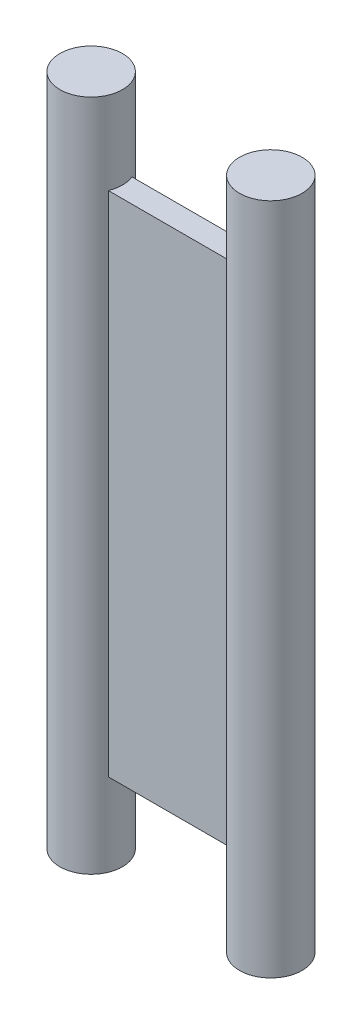
ISO-10303-21;
HEADER;
FILE_DESCRIPTION(('STEP AP214'),'2;1');
FILE_NAME('part.step','',(''),(''),'','','');
FILE_SCHEMA(('AUTOMOTIVE_DESIGN { 1 0 10303 214 1 1 1 1 }'));
ENDSEC;
DATA;
#1=APPLICATION_CONTEXT('core data for automotive mechanical design processes');
#2=APPLICATION_PROTOCOL_DEFINITION('international standard','automotive_design',2000,#1);
#3=PRODUCT_CONTEXT('',#1,'mechanical');
#4=PRODUCT('Part','Part','',(#3));
#5=PRODUCT_RELATED_PRODUCT_CATEGORY('part','',(#4));
#6=PRODUCT_DEFINITION_FORMATION('','',#4);
#7=PRODUCT_DEFINITION_CONTEXT('part definition',#1,'design');
#8=PRODUCT_DEFINITION('design','',#6,#7);
#9=PRODUCT_DEFINITION_SHAPE('','',#8);
#10=(LENGTH_UNIT() NAMED_UNIT(*) SI_UNIT(.MILLI.,.METRE.));
#11=(NAMED_UNIT(*) PLANE_ANGLE_UNIT() SI_UNIT($,.RADIAN.));
#12=(NAMED_UNIT(*) SI_UNIT($,.STERADIAN.) SOLID_ANGLE_UNIT());
#13=UNCERTAINTY_MEASURE_WITH_UNIT(LENGTH_MEASURE(1.E-05),#10,'distance_accuracy_value','');
#14=(GEOMETRIC_REPRESENTATION_CONTEXT(3) GLOBAL_UNCERTAINTY_ASSIGNED_CONTEXT((#13)) GLOBAL_UNIT_ASSIGNED_CONTEXT((#10,
#11,#12)) REPRESENTATION_CONTEXT('',''));
#15=CARTESIAN_POINT('',(0.,0.,0.));
#16=DIRECTION('',(0.,0.,1.));
#17=DIRECTION('',(1.,0.,0.));
#18=AXIS2_PLACEMENT_3D('',#15,#16,#17);
#19=CARTESIAN_POINT('',(3.803,21.5,0.5));
#20=DIRECTION('',(0.,0.,-1.));
#21=DIRECTION('',(-1.,0.,0.));
#22=AXIS2_PLACEMENT_3D('',#19,#20,#21);
#23=PLANE('',#22);
#24=DIRECTION('',(0.,-1.,0.));
#25=VECTOR('',#24,1.);
#26=CARTESIAN_POINT('',(2.5759608808192,25.,0.5));
#27=LINE('',#26,#25);
#28=CARTESIAN_POINT('',(2.5759608808192,21.5,0.5));
#29=VERTEX_POINT('',#28);
#30=CARTESIAN_POINT('',(2.5759608808192,0.,0.499999999999999));
#31=VERTEX_POINT('',#30);
#32=EDGE_CURVE('E53',#29,#31,#27,.T.);
#33=ORIENTED_EDGE('',*,*,#32,.F.);
#34=DIRECTION('',(1.,0.,0.));
#35=VECTOR('',#34,1.);
#36=CARTESIAN_POINT('',(3.803,21.5,0.5));
#37=LINE('',#36,#35);
#38=CARTESIAN_POINT('',(-2.5759608808192,21.5,0.5));
#39=VERTEX_POINT('',#38);
#40=EDGE_CURVE('E90',#39,#29,#37,.T.);
#41=ORIENTED_EDGE('',*,*,#40,.F.);
#42=DIRECTION('',(0.,-1.,0.));
#43=VECTOR('',#42,1.);
#44=CARTESIAN_POINT('',(-2.5759608808192,25.,0.5));
#45=LINE('',#44,#43);
#46=CARTESIAN_POINT('',(-2.5759608808192,0.,0.5));
#47=VERTEX_POINT('',#46);
#48=EDGE_CURVE('E103',#47,#39,#45,.F.);
#49=ORIENTED_EDGE('',*,*,#48,.F.);
#50=DIRECTION('',(1.,0.,0.));
#51=VECTOR('',#50,1.);
#52=CARTESIAN_POINT('',(3.803,0.,0.5));
#53=LINE('',#52,#51);
#54=EDGE_CURVE('E91',#47,#31,#53,.T.);
#55=ORIENTED_EDGE('',*,*,#54,.T.);
#56=EDGE_LOOP('',(#33,#41,#49,#55));
#57=FACE_BOUND('',#56,.T.);
#58=ADVANCED_FACE('F39',(#57),#23,.F.);
#59=CARTESIAN_POINT('',(3.803,21.5,-0.5));
#60=DIRECTION('',(0.,0.,1.));
#61=DIRECTION('',(1.,0.,0.));
#62=AXIS2_PLACEMENT_3D('',#59,#60,#61);
#63=PLANE('',#62);
#64=DIRECTION('',(0.,-1.,0.));
#65=VECTOR('',#64,1.);
#66=CARTESIAN_POINT('',(2.5759608808192,25.,-0.5));
#67=LINE('',#66,#65);
#68=CARTESIAN_POINT('',(2.5759608808192,0.,-0.5));
#69=VERTEX_POINT('',#68);
#70=CARTESIAN_POINT('',(2.5759608808192,21.5,-0.5));
#71=VERTEX_POINT('',#70);
#72=EDGE_CURVE('E78',#69,#71,#67,.F.);
#73=ORIENTED_EDGE('',*,*,#72,.F.);
#74=DIRECTION('',(-1.,0.,0.));
#75=VECTOR('',#74,1.);
#76=CARTESIAN_POINT('',(3.803,0.,-0.5));
#77=LINE('',#76,#75);
#78=CARTESIAN_POINT('',(-2.5759608808192,0.,-0.499999999999999));
#79=VERTEX_POINT('',#78);
#80=EDGE_CURVE('E60',#69,#79,#77,.T.);
#81=ORIENTED_EDGE('',*,*,#80,.T.);
#82=DIRECTION('',(0.,-1.,0.));
#83=VECTOR('',#82,1.);
#84=CARTESIAN_POINT('',(-2.5759608808192,25.,-0.5));
#85=LINE('',#84,#83);
#86=CARTESIAN_POINT('',(-2.5759608808192,21.5,-0.5));
#87=VERTEX_POINT('',#86);
#88=EDGE_CURVE('E105',#87,#79,#85,.T.);
#89=ORIENTED_EDGE('',*,*,#88,.F.);
#90=DIRECTION('',(-1.,0.,0.));
#91=VECTOR('',#90,1.);
#92=CARTESIAN_POINT('',(3.803,21.5,-0.5));
#93=LINE('',#92,#91);
#94=EDGE_CURVE('E85',#71,#87,#93,.T.);
#95=ORIENTED_EDGE('',*,*,#94,.F.);
#96=EDGE_LOOP('',(#73,#81,#89,#95));
#97=FACE_BOUND('',#96,.T.);
#98=ADVANCED_FACE('F84',(#97),#63,.F.);
#99=CARTESIAN_POINT('',(-3.803,25.,0.));
#100=DIRECTION('',(0.,-1.,0.));
#101=DIRECTION('',(0.,0.,-1.));
#102=AXIS2_PLACEMENT_3D('',#99,#100,#101);
#103=CYLINDRICAL_SURFACE('',#102,1.325);
#104=CARTESIAN_POINT('',(-3.803,25.,0.));
#105=DIRECTION('',(0.,1.,0.));
#106=DIRECTION('',(0.,0.,1.));
#107=AXIS2_PLACEMENT_3D('',#104,#105,#106);
#108=CIRCLE('',#107,1.325);
#109=CARTESIAN_POINT('',(-3.803,25.,1.325));
#110=VERTEX_POINT('',#109);
#111=EDGE_CURVE('E107',#110,#110,#108,.T.);
#112=ORIENTED_EDGE('',*,*,#111,.F.);
#113=EDGE_LOOP('',(#112));
#114=FACE_BOUND('',#113,.T.);
#115=CARTESIAN_POINT('',(-3.803,-3.5,0.));
#116=DIRECTION('',(0.,1.,0.));
#117=DIRECTION('',(0.,0.,1.));
#118=AXIS2_PLACEMENT_3D('',#115,#116,#117);
#119=CIRCLE('',#118,1.325);
#120=CARTESIAN_POINT('',(-3.803,-3.5,1.325));
#121=VERTEX_POINT('',#120);
#122=EDGE_CURVE('E108',#121,#121,#119,.T.);
#123=ORIENTED_EDGE('',*,*,#122,.T.);
#124=EDGE_LOOP('',(#123));
#125=FACE_BOUND('',#124,.T.);
#126=ORIENTED_EDGE('',*,*,#48,.T.);
#127=CARTESIAN_POINT('',(-3.803,21.5,0.));
#128=DIRECTION('',(0.,-1.,0.));
#129=DIRECTION('',(0.,0.,-1.));
#130=AXIS2_PLACEMENT_3D('',#127,#128,#129);
#131=CIRCLE('',#130,1.325);
#132=EDGE_CURVE('E95',#39,#87,#131,.F.);
#133=ORIENTED_EDGE('',*,*,#132,.T.);
#134=ORIENTED_EDGE('',*,*,#88,.T.);
#135=CARTESIAN_POINT('',(-3.803,0.,0.));
#136=DIRECTION('',(0.,-1.,0.));
#137=DIRECTION('',(0.,0.,-1.));
#138=AXIS2_PLACEMENT_3D('',#135,#136,#137);
#139=CIRCLE('',#138,1.325);
#140=EDGE_CURVE('E46',#47,#79,#139,.F.);
#141=ORIENTED_EDGE('',*,*,#140,.F.);
#142=EDGE_LOOP('',(#126,#133,#134,#141));
#143=FACE_BOUND('',#142,.T.);
#144=ADVANCED_FACE('F138',(#114,#125,#143),#103,.T.);
#145=CARTESIAN_POINT('',(-3.803,25.,0.));
#146=DIRECTION('',(0.,1.,0.));
#147=DIRECTION('',(0.,0.,1.));
#148=AXIS2_PLACEMENT_3D('',#145,#146,#147);
#149=PLANE('',#148);
#150=ORIENTED_EDGE('',*,*,#111,.T.);
#151=EDGE_LOOP('',(#150));
#152=FACE_BOUND('',#151,.T.);
#153=ADVANCED_FACE('F144',(#152),#149,.T.);
#154=CARTESIAN_POINT('',(-3.803,-3.5,0.));
#155=DIRECTION('',(0.,1.,0.));
#156=DIRECTION('',(0.,0.,1.));
#157=AXIS2_PLACEMENT_3D('',#154,#155,#156);
#158=PLANE('',#157);
#159=ORIENTED_EDGE('',*,*,#122,.F.);
#160=EDGE_LOOP('',(#159));
#161=FACE_BOUND('',#160,.T.);
#162=ADVANCED_FACE('F150',(#161),#158,.F.);
#163=CARTESIAN_POINT('',(0.,21.5,0.));
#164=DIRECTION('',(0.,-1.,0.));
#165=DIRECTION('',(0.,0.,-1.));
#166=AXIS2_PLACEMENT_3D('',#163,#164,#165);
#167=PLANE('',#166);
#168=CARTESIAN_POINT('',(3.803,21.5,0.));
#169=DIRECTION('',(0.,-1.,0.));
#170=DIRECTION('',(0.,0.,-1.));
#171=AXIS2_PLACEMENT_3D('',#168,#169,#170);
#172=CIRCLE('',#171,1.325);
#173=EDGE_CURVE('E111',#71,#29,#172,.F.);
#174=ORIENTED_EDGE('',*,*,#173,.F.);
#175=ORIENTED_EDGE('',*,*,#94,.T.);
#176=ORIENTED_EDGE('',*,*,#132,.F.);
#177=ORIENTED_EDGE('',*,*,#40,.T.);
#178=EDGE_LOOP('',(#174,#175,#176,#177));
#179=FACE_BOUND('',#178,.T.);
#180=ADVANCED_FACE('F141',(#179),#167,.F.);
#181=CARTESIAN_POINT('',(0.,0.,0.));
#182=DIRECTION('',(0.,-1.,0.));
#183=DIRECTION('',(0.,0.,-1.));
#184=AXIS2_PLACEMENT_3D('',#181,#182,#183);
#185=PLANE('',#184);
#186=ORIENTED_EDGE('',*,*,#80,.F.);
#187=CARTESIAN_POINT('',(3.803,0.,0.));
#188=DIRECTION('',(0.,-1.,0.));
#189=DIRECTION('',(0.,0.,-1.));
#190=AXIS2_PLACEMENT_3D('',#187,#188,#189);
#191=CIRCLE('',#190,1.325);
#192=EDGE_CURVE('E11',#69,#31,#191,.F.);
#193=ORIENTED_EDGE('',*,*,#192,.T.);
#194=ORIENTED_EDGE('',*,*,#54,.F.);
#195=ORIENTED_EDGE('',*,*,#140,.T.);
#196=EDGE_LOOP('',(#186,#193,#194,#195));
#197=FACE_BOUND('',#196,.T.);
#198=ADVANCED_FACE('F89',(#197),#185,.T.);
#199=CARTESIAN_POINT('',(3.803,25.,0.));
#200=DIRECTION('',(0.,-1.,0.));
#201=DIRECTION('',(0.,0.,-1.));
#202=AXIS2_PLACEMENT_3D('',#199,#200,#201);
#203=CYLINDRICAL_SURFACE('',#202,1.325);
#204=CARTESIAN_POINT('',(3.803,25.,0.));
#205=DIRECTION('',(0.,1.,0.));
#206=DIRECTION('',(0.,0.,1.));
#207=AXIS2_PLACEMENT_3D('',#204,#205,#206);
#208=CIRCLE('',#207,1.325);
#209=CARTESIAN_POINT('',(3.803,25.,1.325));
#210=VERTEX_POINT('',#209);
#211=EDGE_CURVE('E116',#210,#210,#208,.T.);
#212=ORIENTED_EDGE('',*,*,#211,.F.);
#213=EDGE_LOOP('',(#212));
#214=FACE_BOUND('',#213,.T.);
#215=CARTESIAN_POINT('',(3.803,-3.5,0.));
#216=DIRECTION('',(0.,1.,0.));
#217=DIRECTION('',(0.,0.,1.));
#218=AXIS2_PLACEMENT_3D('',#215,#216,#217);
#219=CIRCLE('',#218,1.325);
#220=CARTESIAN_POINT('',(3.803,-3.5,1.325));
#221=VERTEX_POINT('',#220);
#222=EDGE_CURVE('E86',#221,#221,#219,.T.);
#223=ORIENTED_EDGE('',*,*,#222,.T.);
#224=EDGE_LOOP('',(#223));
#225=FACE_BOUND('',#224,.T.);
#226=ORIENTED_EDGE('',*,*,#72,.T.);
#227=ORIENTED_EDGE('',*,*,#173,.T.);
#228=ORIENTED_EDGE('',*,*,#32,.T.);
#229=ORIENTED_EDGE('',*,*,#192,.F.);
#230=EDGE_LOOP('',(#226,#227,#228,#229));
#231=FACE_BOUND('',#230,.T.);
#232=ADVANCED_FACE('F77',(#214,#225,#231),#203,.T.);
#233=CARTESIAN_POINT('',(3.803,25.,0.));
#234=DIRECTION('',(0.,1.,0.));
#235=DIRECTION('',(0.,0.,1.));
#236=AXIS2_PLACEMENT_3D('',#233,#234,#235);
#237=PLANE('',#236);
#238=ORIENTED_EDGE('',*,*,#211,.T.);
#239=EDGE_LOOP('',(#238));
#240=FACE_BOUND('',#239,.T.);
#241=ADVANCED_FACE('F125',(#240),#237,.T.);
#242=CARTESIAN_POINT('',(3.803,-3.5,0.));
#243=DIRECTION('',(0.,1.,0.));
#244=DIRECTION('',(0.,0.,1.));
#245=AXIS2_PLACEMENT_3D('',#242,#243,#244);
#246=PLANE('',#245);
#247=ORIENTED_EDGE('',*,*,#222,.F.);
#248=EDGE_LOOP('',(#247));
#249=FACE_BOUND('',#248,.T.);
#250=ADVANCED_FACE('F123',(#249),#246,.F.);
#251=CLOSED_SHELL('',(#58,#98,#144,#153,#162,#180,#198,#232,#241,#250));
#252=MANIFOLD_SOLID_BREP('B2',#251);
#253=ADVANCED_BREP_SHAPE_REPRESENTATION('',(#18,#252),#14);
#254=SHAPE_DEFINITION_REPRESENTATION(#9,#253);
ENDSEC;
END-ISO-10303-21;
